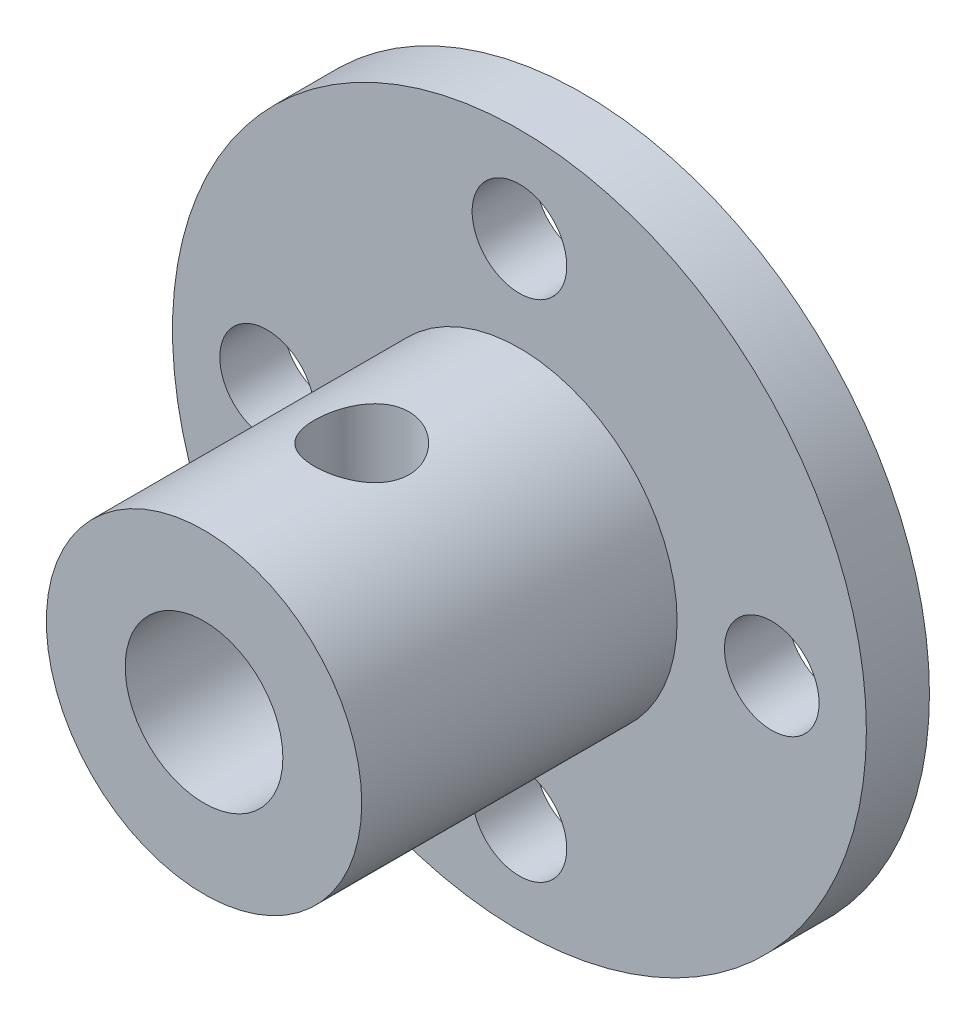
ISO-10303-21;
HEADER;
FILE_DESCRIPTION(('STEP AP214'),'2;1');
FILE_NAME('part.step','',(''),(''),'','','');
FILE_SCHEMA(('AUTOMOTIVE_DESIGN { 1 0 10303 214 1 1 1 1 }'));
ENDSEC;
DATA;
#1=APPLICATION_CONTEXT('core data for automotive mechanical design processes');
#2=APPLICATION_PROTOCOL_DEFINITION('international standard','automotive_design',2000,#1);
#3=PRODUCT_CONTEXT('',#1,'mechanical');
#4=PRODUCT('Part','Part','',(#3));
#5=PRODUCT_RELATED_PRODUCT_CATEGORY('part','',(#4));
#6=PRODUCT_DEFINITION_FORMATION('','',#4);
#7=PRODUCT_DEFINITION_CONTEXT('part definition',#1,'design');
#8=PRODUCT_DEFINITION('design','',#6,#7);
#9=PRODUCT_DEFINITION_SHAPE('','',#8);
#10=(LENGTH_UNIT() NAMED_UNIT(*) SI_UNIT(.MILLI.,.METRE.));
#11=(NAMED_UNIT(*) PLANE_ANGLE_UNIT() SI_UNIT($,.RADIAN.));
#12=(NAMED_UNIT(*) SI_UNIT($,.STERADIAN.) SOLID_ANGLE_UNIT());
#13=UNCERTAINTY_MEASURE_WITH_UNIT(LENGTH_MEASURE(1.E-05),#10,'distance_accuracy_value','');
#14=(GEOMETRIC_REPRESENTATION_CONTEXT(3) GLOBAL_UNCERTAINTY_ASSIGNED_CONTEXT((#13)) GLOBAL_UNIT_ASSIGNED_CONTEXT((#10,
#11,#12)) REPRESENTATION_CONTEXT('',''));
#15=CARTESIAN_POINT('',(0.,0.,0.));
#16=DIRECTION('',(0.,0.,1.));
#17=DIRECTION('',(1.,0.,0.));
#18=AXIS2_PLACEMENT_3D('',#15,#16,#17);
#19=CARTESIAN_POINT('',(0.,0.,2.));
#20=DIRECTION('',(0.,0.,1.));
#21=DIRECTION('',(1.,0.,0.));
#22=AXIS2_PLACEMENT_3D('',#19,#20,#21);
#23=PLANE('',#22);
#24=CARTESIAN_POINT('',(0.,-8.,2.));
#25=DIRECTION('',(0.,0.,1.));
#26=DIRECTION('',(1.,0.,0.));
#27=AXIS2_PLACEMENT_3D('',#24,#25,#26);
#28=CIRCLE('',#27,1.5);
#29=CARTESIAN_POINT('',(1.5,-8.,2.));
#30=VERTEX_POINT('',#29);
#31=EDGE_CURVE('E129',#30,#30,#28,.T.);
#32=ORIENTED_EDGE('',*,*,#31,.F.);
#33=EDGE_LOOP('',(#32));
#34=FACE_BOUND('',#33,.T.);
#35=CARTESIAN_POINT('',(0.,8.,2.));
#36=DIRECTION('',(0.,0.,1.));
#37=DIRECTION('',(1.,0.,0.));
#38=AXIS2_PLACEMENT_3D('',#35,#36,#37);
#39=CIRCLE('',#38,1.5);
#40=CARTESIAN_POINT('',(1.5,8.,2.));
#41=VERTEX_POINT('',#40);
#42=EDGE_CURVE('E143',#41,#41,#39,.T.);
#43=ORIENTED_EDGE('',*,*,#42,.F.);
#44=EDGE_LOOP('',(#43));
#45=FACE_BOUND('',#44,.T.);
#46=CARTESIAN_POINT('',(-8.,0.,2.));
#47=DIRECTION('',(0.,0.,1.));
#48=DIRECTION('',(1.,0.,0.));
#49=AXIS2_PLACEMENT_3D('',#46,#47,#48);
#50=CIRCLE('',#49,1.5);
#51=CARTESIAN_POINT('',(-6.5,0.,2.));
#52=VERTEX_POINT('',#51);
#53=EDGE_CURVE('E50',#52,#52,#50,.T.);
#54=ORIENTED_EDGE('',*,*,#53,.F.);
#55=EDGE_LOOP('',(#54));
#56=FACE_BOUND('',#55,.T.);
#57=CARTESIAN_POINT('',(0.,0.,2.));
#58=DIRECTION('',(0.,0.,1.));
#59=DIRECTION('',(1.,0.,0.));
#60=AXIS2_PLACEMENT_3D('',#57,#58,#59);
#61=CIRCLE('',#60,11.);
#62=CARTESIAN_POINT('',(11.,0.,2.));
#63=VERTEX_POINT('',#62);
#64=EDGE_CURVE('E10',#63,#63,#61,.T.);
#65=ORIENTED_EDGE('',*,*,#64,.T.);
#66=EDGE_LOOP('',(#65));
#67=FACE_BOUND('',#66,.T.);
#68=CARTESIAN_POINT('',(8.,0.,2.));
#69=DIRECTION('',(0.,0.,1.));
#70=DIRECTION('',(1.,0.,0.));
#71=AXIS2_PLACEMENT_3D('',#68,#69,#70);
#72=CIRCLE('',#71,1.5);
#73=CARTESIAN_POINT('',(9.5,0.,2.));
#74=VERTEX_POINT('',#73);
#75=EDGE_CURVE('E139',#74,#74,#72,.T.);
#76=ORIENTED_EDGE('',*,*,#75,.F.);
#77=EDGE_LOOP('',(#76));
#78=FACE_BOUND('',#77,.T.);
#79=CARTESIAN_POINT('',(0.,0.,2.));
#80=DIRECTION('',(0.,0.,1.));
#81=DIRECTION('',(1.,0.,0.));
#82=AXIS2_PLACEMENT_3D('',#79,#80,#81);
#83=CIRCLE('',#82,5.);
#84=CARTESIAN_POINT('',(5.,0.,2.));
#85=VERTEX_POINT('',#84);
#86=EDGE_CURVE('E135',#85,#85,#83,.T.);
#87=ORIENTED_EDGE('',*,*,#86,.F.);
#88=EDGE_LOOP('',(#87));
#89=FACE_BOUND('',#88,.T.);
#90=ADVANCED_FACE('F32',(#34,#45,#56,#67,#78,#89),#23,.T.);
#91=CARTESIAN_POINT('',(0.,0.,0.));
#92=DIRECTION('',(0.,0.,1.));
#93=DIRECTION('',(1.,0.,0.));
#94=AXIS2_PLACEMENT_3D('',#91,#92,#93);
#95=PLANE('',#94);
#96=CARTESIAN_POINT('',(0.,0.,0.));
#97=DIRECTION('',(0.,0.,1.));
#98=DIRECTION('',(1.,0.,0.));
#99=AXIS2_PLACEMENT_3D('',#96,#97,#98);
#100=CIRCLE('',#99,11.);
#101=CARTESIAN_POINT('',(11.,0.,0.));
#102=VERTEX_POINT('',#101);
#103=EDGE_CURVE('E45',#102,#102,#100,.T.);
#104=ORIENTED_EDGE('',*,*,#103,.F.);
#105=EDGE_LOOP('',(#104));
#106=FACE_BOUND('',#105,.T.);
#107=CARTESIAN_POINT('',(-8.,0.,0.));
#108=DIRECTION('',(0.,0.,1.));
#109=DIRECTION('',(1.,0.,0.));
#110=AXIS2_PLACEMENT_3D('',#107,#108,#109);
#111=CIRCLE('',#110,1.5);
#112=CARTESIAN_POINT('',(-6.5,0.,0.));
#113=VERTEX_POINT('',#112);
#114=EDGE_CURVE('E53',#113,#113,#111,.T.);
#115=ORIENTED_EDGE('',*,*,#114,.T.);
#116=EDGE_LOOP('',(#115));
#117=FACE_BOUND('',#116,.T.);
#118=CARTESIAN_POINT('',(0.,0.,0.));
#119=DIRECTION('',(0.,0.,1.));
#120=DIRECTION('',(1.,0.,0.));
#121=AXIS2_PLACEMENT_3D('',#118,#119,#120);
#122=CIRCLE('',#121,2.5);
#123=CARTESIAN_POINT('',(2.5,0.,0.));
#124=VERTEX_POINT('',#123);
#125=EDGE_CURVE('E116',#124,#124,#122,.T.);
#126=ORIENTED_EDGE('',*,*,#125,.T.);
#127=EDGE_LOOP('',(#126));
#128=FACE_BOUND('',#127,.T.);
#129=CARTESIAN_POINT('',(0.,8.,0.));
#130=DIRECTION('',(0.,0.,1.));
#131=DIRECTION('',(1.,0.,0.));
#132=AXIS2_PLACEMENT_3D('',#129,#130,#131);
#133=CIRCLE('',#132,1.5);
#134=CARTESIAN_POINT('',(1.5,8.,0.));
#135=VERTEX_POINT('',#134);
#136=EDGE_CURVE('E120',#135,#135,#133,.T.);
#137=ORIENTED_EDGE('',*,*,#136,.T.);
#138=EDGE_LOOP('',(#137));
#139=FACE_BOUND('',#138,.T.);
#140=CARTESIAN_POINT('',(8.,0.,0.));
#141=DIRECTION('',(0.,0.,1.));
#142=DIRECTION('',(1.,0.,0.));
#143=AXIS2_PLACEMENT_3D('',#140,#141,#142);
#144=CIRCLE('',#143,1.5);
#145=CARTESIAN_POINT('',(9.5,0.,0.));
#146=VERTEX_POINT('',#145);
#147=EDGE_CURVE('E124',#146,#146,#144,.T.);
#148=ORIENTED_EDGE('',*,*,#147,.T.);
#149=EDGE_LOOP('',(#148));
#150=FACE_BOUND('',#149,.T.);
#151=CARTESIAN_POINT('',(0.,-8.,0.));
#152=DIRECTION('',(0.,0.,1.));
#153=DIRECTION('',(1.,0.,0.));
#154=AXIS2_PLACEMENT_3D('',#151,#152,#153);
#155=CIRCLE('',#154,1.5);
#156=CARTESIAN_POINT('',(1.5,-8.,0.));
#157=VERTEX_POINT('',#156);
#158=EDGE_CURVE('E127',#157,#157,#155,.T.);
#159=ORIENTED_EDGE('',*,*,#158,.T.);
#160=EDGE_LOOP('',(#159));
#161=FACE_BOUND('',#160,.T.);
#162=ADVANCED_FACE('F100',(#106,#117,#128,#139,#150,#161),#95,.F.);
#163=CARTESIAN_POINT('',(0.,0.,2.));
#164=DIRECTION('',(0.,0.,-1.));
#165=DIRECTION('',(-1.,0.,0.));
#166=AXIS2_PLACEMENT_3D('',#163,#164,#165);
#167=CYLINDRICAL_SURFACE('',#166,11.);
#168=ORIENTED_EDGE('',*,*,#64,.F.);
#169=EDGE_LOOP('',(#168));
#170=FACE_BOUND('',#169,.T.);
#171=ORIENTED_EDGE('',*,*,#103,.T.);
#172=EDGE_LOOP('',(#171));
#173=FACE_BOUND('',#172,.T.);
#174=ADVANCED_FACE('F34',(#170,#173),#167,.T.);
#175=CARTESIAN_POINT('',(-8.,0.,2.));
#176=DIRECTION('',(0.,0.,-1.));
#177=DIRECTION('',(-1.,0.,0.));
#178=AXIS2_PLACEMENT_3D('',#175,#176,#177);
#179=CYLINDRICAL_SURFACE('',#178,1.5);
#180=ORIENTED_EDGE('',*,*,#53,.T.);
#181=EDGE_LOOP('',(#180));
#182=FACE_BOUND('',#181,.T.);
#183=ORIENTED_EDGE('',*,*,#114,.F.);
#184=EDGE_LOOP('',(#183));
#185=FACE_BOUND('',#184,.T.);
#186=ADVANCED_FACE('F92',(#182,#185),#179,.F.);
#187=CARTESIAN_POINT('',(0.,0.,2.));
#188=DIRECTION('',(0.,0.,-1.));
#189=DIRECTION('',(-1.,0.,0.));
#190=AXIS2_PLACEMENT_3D('',#187,#188,#189);
#191=CYLINDRICAL_SURFACE('',#190,2.5);
#192=CARTESIAN_POINT('',(0.,-2.5,8.5));
#193=CARTESIAN_POINT('',(0.0767298334620158,-2.49999625789732,8.49999590899012));
#194=CARTESIAN_POINT('',(0.153582320644178,-2.4964290461501,8.49407132907374));
#195=CARTESIAN_POINT('',(0.304975509530679,-2.48249903608568,8.47067568048467));
#196=CARTESIAN_POINT('',(0.379510034596047,-2.47211948032719,8.45317613814578));
#197=CARTESIAN_POINT('',(0.523751827790837,-2.44561558054488,8.40761363883314));
#198=CARTESIAN_POINT('',(0.593481028226566,-2.42951973272944,8.37960304183684));
#199=CARTESIAN_POINT('',(0.727030318214659,-2.39295367626407,8.31413966685897));
#200=CARTESIAN_POINT('',(0.790851869416383,-2.37248455380255,8.27668923303125));
#201=CARTESIAN_POINT('',(0.916299278999315,-2.32705360719088,8.19022517329142));
#202=CARTESIAN_POINT('',(0.977384020081416,-2.30186792195985,8.14054630464861));
#203=CARTESIAN_POINT('',(1.09088270411891,-2.25030439279634,8.03253279617173));
#204=CARTESIAN_POINT('',(1.14328534948112,-2.22392505153571,7.97418706281268));
#205=CARTESIAN_POINT('',(1.24444996762974,-2.1691106699591,7.84207648950327));
#206=CARTESIAN_POINT('',(1.29197766378809,-2.14082017703649,7.76729822901871));
#207=CARTESIAN_POINT('',(1.37361437764896,-2.08938301412124,7.60915342675689));
#208=CARTESIAN_POINT('',(1.4077451733516,-2.06622802273938,7.52580110375243));
#209=CARTESIAN_POINT('',(1.45440601714222,-2.0335462966093,7.37340354934676));
#210=CARTESIAN_POINT('',(1.47016197246826,-2.02207883137591,7.30576400138968));
#211=CARTESIAN_POINT('',(1.49216172340475,-2.00590308295503,7.16819628416964));
#212=CARTESIAN_POINT('',(1.49841734556836,-2.00118639643759,7.09827107124551));
#213=CARTESIAN_POINT('',(1.50105508796009,-1.99920922463856,6.95798850578266));
#214=CARTESIAN_POINT('',(1.49741783408419,-2.00196337012718,6.8876305749068));
#215=CARTESIAN_POINT('',(1.48046060478828,-2.01453261443741,6.74872122457241));
#216=CARTESIAN_POINT('',(1.46713334620103,-2.02435302432226,6.68017120415255));
#217=CARTESIAN_POINT('',(1.43173921881792,-2.04953186944258,6.54746975787189));
#218=CARTESIAN_POINT('',(1.40978748666087,-2.06481711652537,6.48327294607552));
#219=CARTESIAN_POINT('',(1.35795061770837,-2.09927051350828,6.35930500907188));
#220=CARTESIAN_POINT('',(1.32806257259705,-2.11844008623465,6.29953551657607));
#221=CARTESIAN_POINT('',(1.25517983184583,-2.16255327268985,6.1750159028772));
#222=CARTESIAN_POINT('',(1.21080724397723,-2.18792043372992,6.11122190704507));
#223=CARTESIAN_POINT('',(1.11291092784003,-2.23930599764381,5.99132351633298));
#224=CARTESIAN_POINT('',(1.05937845100579,-2.26532500262149,5.93522656602349));
#225=CARTESIAN_POINT('',(0.935811834382965,-2.31935504958317,5.82438701817824));
#226=CARTESIAN_POINT('',(0.864517682704956,-2.34713836268532,5.77092269398401));
#227=CARTESIAN_POINT('',(0.712276050458999,-2.39772428433981,5.67687795280209));
#228=CARTESIAN_POINT('',(0.631333763943563,-2.42052955425515,5.63629064621005));
#229=CARTESIAN_POINT('',(0.467197585268205,-2.45730392066151,5.5720678172041));
#230=CARTESIAN_POINT('',(0.384467624173579,-2.47173957439704,5.54752464428409));
#231=CARTESIAN_POINT('',(0.215047895144638,-2.49218842813551,5.51298880259462));
#232=CARTESIAN_POINT('',(0.128363005661318,-2.49821172952738,5.50297868224642));
#233=CARTESIAN_POINT('',(-0.0337146143773977,-2.5009057037461,5.49849215232169));
#234=CARTESIAN_POINT('',(-0.109042473418719,-2.49873521714286,5.50209114491483));
#235=CARTESIAN_POINT('',(-0.257829401986062,-2.48778712087048,5.52042585307192));
#236=CARTESIAN_POINT('',(-0.331288509376107,-2.47900964518037,5.53516134280581));
#237=CARTESIAN_POINT('',(-0.472574932157613,-2.4559479244219,5.57454343281246));
#238=CARTESIAN_POINT('',(-0.540495750928484,-2.44180275662555,5.59894034907347));
#239=CARTESIAN_POINT('',(-0.671265749087263,-2.40913880862844,5.65667737636527));
#240=CARTESIAN_POINT('',(-0.734113924963909,-2.39061916586511,5.69001925134667));
#241=CARTESIAN_POINT('',(-0.860006262823864,-2.3484549623736,5.76855697920871));
#242=CARTESIAN_POINT('',(-0.922394150456837,-2.3244780273988,5.81462382907839));
#243=CARTESIAN_POINT('',(-1.03902603131014,-2.27474265574732,5.91539139348862));
#244=CARTESIAN_POINT('',(-1.09326040273738,-2.2489821658636,5.97010215485254));
#245=CARTESIAN_POINT('',(-1.19931996735579,-2.19445423909891,6.09491039003715));
#246=CARTESIAN_POINT('',(-1.24991019630915,-2.16573241746291,6.1660838854655));
#247=CARTESIAN_POINT('',(-1.33845238915668,-2.1121618206671,6.3172160245682));
#248=CARTESIAN_POINT('',(-1.37641766769781,-2.0873089799769,6.39716529389279));
#249=CARTESIAN_POINT('',(-1.43142578795776,-2.04984909240519,6.54624302230669));
#250=CARTESIAN_POINT('',(-1.4512162533619,-2.03575659328729,6.61398031235859));
#251=CARTESIAN_POINT('',(-1.48113663905972,-2.01409605743544,6.7525320780801));
#252=CARTESIAN_POINT('',(-1.49127995297631,-2.00651897642721,6.82334214432783));
#253=CARTESIAN_POINT('',(-1.50134130416631,-1.99900446616268,6.96637694759703));
#254=CARTESIAN_POINT('',(-1.50122089107869,-1.99909576445937,7.03860599068704));
#255=CARTESIAN_POINT('',(-1.49066472959328,-2.0069771789285,7.18189443560946));
#256=CARTESIAN_POINT('',(-1.48022337215759,-2.0147714813882,7.2529531800806));
#257=CARTESIAN_POINT('',(-1.45040174148913,-2.0363318524298,7.38848841757219));
#258=CARTESIAN_POINT('',(-1.43147636845351,-2.04979211805581,7.45311709430687));
#259=CARTESIAN_POINT('',(-1.38563242076993,-2.08105501960151,7.57833725447422));
#260=CARTESIAN_POINT('',(-1.35871083588479,-2.09885929040482,7.63892720696055));
#261=CARTESIAN_POINT('',(-1.29289245555732,-2.14012990550917,7.76431985722078));
#262=CARTESIAN_POINT('',(-1.25279167675753,-2.16404587582639,7.82834110385431));
#263=CARTESIAN_POINT('',(-1.16375698389084,-2.21320127030768,7.94938007261729));
#264=CARTESIAN_POINT('',(-1.11481579607798,-2.23844177205021,8.00639196215256));
#265=CARTESIAN_POINT('',(-1.00009777425734,-2.29225690291476,8.12135094913167));
#266=CARTESIAN_POINT('',(-0.932876819313905,-2.32070308663658,8.17793107489619));
#267=CARTESIAN_POINT('',(-0.788462434445589,-2.37365428872367,8.27909785586331));
#268=CARTESIAN_POINT('',(-0.71126544450154,-2.39815789310936,8.32368021198479));
#269=CARTESIAN_POINT('',(-0.551125230801454,-2.43985578654394,8.39778580757374));
#270=CARTESIAN_POINT('',(-0.468430086957214,-2.45725077479787,8.42772806492683));
#271=CARTESIAN_POINT('',(-0.297973306118807,-2.48366273001246,8.47272469521097));
#272=CARTESIAN_POINT('',(-0.210232099648612,-2.49271125871485,8.48783516785699));
#273=CARTESIAN_POINT('',(-0.101558096917536,-2.49802001168187,8.49669745470866));
#274=CARTESIAN_POINT('',(-0.0812762590282772,-2.49876114656362,8.4979344173061));
#275=CARTESIAN_POINT('',(-0.0406658206871122,-2.49975164517367,8.49958624637086));
#276=CARTESIAN_POINT('',(-0.0203372186375694,-2.50000099184316,8.50000108432091));
#277=CARTESIAN_POINT('',(0.,-2.5,8.5));
#278=B_SPLINE_CURVE_WITH_KNOTS('',3,(#192,#193,#194,#195,#196,#197,#198,#199,#200,#201,#202,
#203,#204,#205,#206,#207,#208,#209,#210,#211,#212,#213,#214,#215,#216,#217,#218,#219,#220,#221,
#222,#223,#224,#225,#226,#227,#228,#229,#230,#231,#232,#233,#234,#235,#236,#237,#238,#239,#240,
#241,#242,#243,#244,#245,#246,#247,#248,#249,#250,#251,#252,#253,#254,#255,#256,#257,#258,#259,
#260,#261,#262,#263,#264,#265,#266,#267,#268,#269,#270,#271,#272,#273,#274,#275,#276,#277),
.UNSPECIFIED.,.T.,.F.,(4,2,2,2,2,2,2,2,2,2,2,2,2,2,2,2,2,2,2,2,2,2,2,2,2,2,2,2,2,2,2,2,2,2,2,2,
2,2,2,2,2,2,4),(0.,0.230102237548649,0.460772627520012,0.690308884600013,0.919788197992275,
1.16681590732473,1.414162579348,1.69183813189807,1.96906040692092,2.17933829855633,
2.38935420916578,2.59978170870726,2.81036753273872,3.01823267593207,3.22617409809868,
3.47046995225163,3.71500044803674,3.99360957884691,4.27206939275324,4.5329679069656,
4.79355286918236,5.01875602722426,5.24395461863455,5.46367785689772,5.68344445659025,
5.92601365818362,6.16886690081836,6.44336762428009,6.71757792616456,6.93257787314692,
7.14727888733318,7.36278425777433,7.57840681155725,7.78364098331142,7.98895251523035,
8.22578610052286,8.46281544370207,8.73854311775519,9.01436946031985,9.28175654462677,
9.54812832184448,9.60911473335177,9.6701032602764),.UNSPECIFIED.);
#279=CARTESIAN_POINT('',(0.,-2.5,8.5));
#280=VERTEX_POINT('',#279);
#281=EDGE_CURVE('E81',#280,#280,#278,.T.);
#282=ORIENTED_EDGE('',*,*,#281,.F.);
#283=EDGE_LOOP('',(#282));
#284=FACE_BOUND('',#283,.T.);
#285=CARTESIAN_POINT('',(0.,2.5,8.5));
#286=CARTESIAN_POINT('',(-0.0767298334620158,2.49999625789732,8.49999590899012));
#287=CARTESIAN_POINT('',(-0.153582320644178,2.4964290461501,8.49407132907374));
#288=CARTESIAN_POINT('',(-0.304975509530679,2.48249903608568,8.47067568048467));
#289=CARTESIAN_POINT('',(-0.379510034596047,2.47211948032719,8.45317613814578));
#290=CARTESIAN_POINT('',(-0.523751827790837,2.44561558054488,8.40761363883314));
#291=CARTESIAN_POINT('',(-0.593481028226566,2.42951973272944,8.37960304183684));
#292=CARTESIAN_POINT('',(-0.727030318214659,2.39295367626407,8.31413966685897));
#293=CARTESIAN_POINT('',(-0.790851869416383,2.37248455380255,8.27668923303125));
#294=CARTESIAN_POINT('',(-0.916299278999315,2.32705360719088,8.19022517329142));
#295=CARTESIAN_POINT('',(-0.977384020081416,2.30186792195985,8.14054630464861));
#296=CARTESIAN_POINT('',(-1.09088270411891,2.25030439279634,8.03253279617173));
#297=CARTESIAN_POINT('',(-1.14328534948112,2.22392505153571,7.97418706281268));
#298=CARTESIAN_POINT('',(-1.24444996762974,2.1691106699591,7.84207648950327));
#299=CARTESIAN_POINT('',(-1.29197766378809,2.14082017703649,7.76729822901871));
#300=CARTESIAN_POINT('',(-1.37361437764896,2.08938301412124,7.60915342675689));
#301=CARTESIAN_POINT('',(-1.4077451733516,2.06622802273938,7.52580110375243));
#302=CARTESIAN_POINT('',(-1.45440601714222,2.0335462966093,7.37340354934676));
#303=CARTESIAN_POINT('',(-1.47016197246826,2.02207883137591,7.30576400138968));
#304=CARTESIAN_POINT('',(-1.49216172340475,2.00590308295503,7.16819628416964));
#305=CARTESIAN_POINT('',(-1.49841734556836,2.00118639643759,7.09827107124551));
#306=CARTESIAN_POINT('',(-1.50105508796009,1.99920922463856,6.95798850578266));
#307=CARTESIAN_POINT('',(-1.49741783408419,2.00196337012718,6.8876305749068));
#308=CARTESIAN_POINT('',(-1.48046060478828,2.01453261443741,6.74872122457241));
#309=CARTESIAN_POINT('',(-1.46713334620103,2.02435302432226,6.68017120415255));
#310=CARTESIAN_POINT('',(-1.43173921881792,2.04953186944258,6.54746975787189));
#311=CARTESIAN_POINT('',(-1.40978748666087,2.06481711652537,6.48327294607552));
#312=CARTESIAN_POINT('',(-1.35795061770837,2.09927051350828,6.35930500907188));
#313=CARTESIAN_POINT('',(-1.32806257259705,2.11844008623465,6.29953551657607));
#314=CARTESIAN_POINT('',(-1.25517983184583,2.16255327268985,6.1750159028772));
#315=CARTESIAN_POINT('',(-1.21080724397723,2.18792043372992,6.11122190704507));
#316=CARTESIAN_POINT('',(-1.11291092784003,2.23930599764381,5.99132351633298));
#317=CARTESIAN_POINT('',(-1.05937845100579,2.26532500262149,5.93522656602349));
#318=CARTESIAN_POINT('',(-0.935811834382965,2.31935504958317,5.82438701817824));
#319=CARTESIAN_POINT('',(-0.864517682704956,2.34713836268532,5.77092269398401));
#320=CARTESIAN_POINT('',(-0.712276050458999,2.39772428433981,5.67687795280209));
#321=CARTESIAN_POINT('',(-0.631333763943563,2.42052955425515,5.63629064621005));
#322=CARTESIAN_POINT('',(-0.467197585268205,2.45730392066151,5.5720678172041));
#323=CARTESIAN_POINT('',(-0.384467624173579,2.47173957439704,5.54752464428409));
#324=CARTESIAN_POINT('',(-0.215047895144638,2.49218842813551,5.51298880259462));
#325=CARTESIAN_POINT('',(-0.128363005661318,2.49821172952738,5.50297868224642));
#326=CARTESIAN_POINT('',(0.0337146143773977,2.5009057037461,5.49849215232169));
#327=CARTESIAN_POINT('',(0.109042473418719,2.49873521714286,5.50209114491483));
#328=CARTESIAN_POINT('',(0.257829401986062,2.48778712087048,5.52042585307192));
#329=CARTESIAN_POINT('',(0.331288509376107,2.47900964518037,5.53516134280581));
#330=CARTESIAN_POINT('',(0.472574932157613,2.4559479244219,5.57454343281246));
#331=CARTESIAN_POINT('',(0.540495750928484,2.44180275662555,5.59894034907347));
#332=CARTESIAN_POINT('',(0.671265749087263,2.40913880862844,5.65667737636527));
#333=CARTESIAN_POINT('',(0.734113924963909,2.39061916586511,5.69001925134667));
#334=CARTESIAN_POINT('',(0.860006262823864,2.3484549623736,5.76855697920871));
#335=CARTESIAN_POINT('',(0.922394150456837,2.3244780273988,5.81462382907839));
#336=CARTESIAN_POINT('',(1.03902603131014,2.27474265574732,5.91539139348862));
#337=CARTESIAN_POINT('',(1.09326040273738,2.2489821658636,5.97010215485254));
#338=CARTESIAN_POINT('',(1.19931996735579,2.19445423909891,6.09491039003715));
#339=CARTESIAN_POINT('',(1.24991019630915,2.16573241746291,6.1660838854655));
#340=CARTESIAN_POINT('',(1.33845238915668,2.1121618206671,6.3172160245682));
#341=CARTESIAN_POINT('',(1.37641766769781,2.0873089799769,6.39716529389279));
#342=CARTESIAN_POINT('',(1.43142578795776,2.04984909240519,6.54624302230669));
#343=CARTESIAN_POINT('',(1.4512162533619,2.03575659328729,6.61398031235859));
#344=CARTESIAN_POINT('',(1.48113663905972,2.01409605743544,6.7525320780801));
#345=CARTESIAN_POINT('',(1.49127995297631,2.00651897642721,6.82334214432783));
#346=CARTESIAN_POINT('',(1.50134130416631,1.99900446616268,6.96637694759703));
#347=CARTESIAN_POINT('',(1.50122089107869,1.99909576445937,7.03860599068704));
#348=CARTESIAN_POINT('',(1.49066472959328,2.0069771789285,7.18189443560946));
#349=CARTESIAN_POINT('',(1.48022337215759,2.0147714813882,7.2529531800806));
#350=CARTESIAN_POINT('',(1.45040174148913,2.0363318524298,7.38848841757219));
#351=CARTESIAN_POINT('',(1.43147636845351,2.04979211805581,7.45311709430687));
#352=CARTESIAN_POINT('',(1.38563242076993,2.08105501960151,7.57833725447422));
#353=CARTESIAN_POINT('',(1.35871083588479,2.09885929040482,7.63892720696055));
#354=CARTESIAN_POINT('',(1.29289245555732,2.14012990550917,7.76431985722078));
#355=CARTESIAN_POINT('',(1.25279167675753,2.16404587582639,7.82834110385431));
#356=CARTESIAN_POINT('',(1.16375698389084,2.21320127030768,7.94938007261729));
#357=CARTESIAN_POINT('',(1.11481579607798,2.23844177205021,8.00639196215256));
#358=CARTESIAN_POINT('',(1.00009777425734,2.29225690291476,8.12135094913167));
#359=CARTESIAN_POINT('',(0.932876819313905,2.32070308663658,8.17793107489619));
#360=CARTESIAN_POINT('',(0.788462434445589,2.37365428872367,8.27909785586331));
#361=CARTESIAN_POINT('',(0.71126544450154,2.39815789310936,8.32368021198479));
#362=CARTESIAN_POINT('',(0.551125230801454,2.43985578654394,8.39778580757374));
#363=CARTESIAN_POINT('',(0.468430086957214,2.45725077479787,8.42772806492683));
#364=CARTESIAN_POINT('',(0.297973306118807,2.48366273001246,8.47272469521097));
#365=CARTESIAN_POINT('',(0.210232099648612,2.49271125871485,8.48783516785699));
#366=CARTESIAN_POINT('',(0.101558096917536,2.49802001168187,8.49669745470866));
#367=CARTESIAN_POINT('',(0.0812762590282772,2.49876114656362,8.4979344173061));
#368=CARTESIAN_POINT('',(0.0406658206871122,2.49975164517367,8.49958624637086));
#369=CARTESIAN_POINT('',(0.0203372186375694,2.50000099184316,8.50000108432091));
#370=CARTESIAN_POINT('',(0.,2.5,8.5));
#371=B_SPLINE_CURVE_WITH_KNOTS('',3,(#285,#286,#287,#288,#289,#290,#291,#292,#293,#294,#295,
#296,#297,#298,#299,#300,#301,#302,#303,#304,#305,#306,#307,#308,#309,#310,#311,#312,#313,#314,
#315,#316,#317,#318,#319,#320,#321,#322,#323,#324,#325,#326,#327,#328,#329,#330,#331,#332,#333,
#334,#335,#336,#337,#338,#339,#340,#341,#342,#343,#344,#345,#346,#347,#348,#349,#350,#351,#352,
#353,#354,#355,#356,#357,#358,#359,#360,#361,#362,#363,#364,#365,#366,#367,#368,#369,#370),
.UNSPECIFIED.,.T.,.F.,(4,2,2,2,2,2,2,2,2,2,2,2,2,2,2,2,2,2,2,2,2,2,2,2,2,2,2,2,2,2,2,2,2,2,2,2,
2,2,2,2,2,2,4),(0.,0.230102237548649,0.460772627520012,0.690308884600013,0.919788197992275,
1.16681590732473,1.414162579348,1.69183813189807,1.96906040692092,2.17933829855633,
2.38935420916578,2.59978170870726,2.81036753273872,3.01823267593207,3.22617409809868,
3.47046995225163,3.71500044803674,3.99360957884691,4.27206939275324,4.5329679069656,
4.79355286918236,5.01875602722426,5.24395461863455,5.46367785689772,5.68344445659025,
5.92601365818362,6.16886690081836,6.44336762428009,6.71757792616456,6.93257787314692,
7.14727888733318,7.36278425777433,7.57840681155725,7.78364098331142,7.98895251523035,
8.22578610052286,8.46281544370207,8.73854311775519,9.01436946031985,9.28175654462677,
9.54812832184448,9.60911473335177,9.6701032602764),.UNSPECIFIED.);
#372=CARTESIAN_POINT('',(0.,2.5,8.5));
#373=VERTEX_POINT('',#372);
#374=EDGE_CURVE('E75',#373,#373,#371,.T.);
#375=ORIENTED_EDGE('',*,*,#374,.F.);
#376=EDGE_LOOP('',(#375));
#377=FACE_BOUND('',#376,.T.);
#378=ORIENTED_EDGE('',*,*,#125,.F.);
#379=EDGE_LOOP('',(#378));
#380=FACE_BOUND('',#379,.T.);
#381=CARTESIAN_POINT('',(0.,0.,12.));
#382=DIRECTION('',(0.,0.,1.));
#383=DIRECTION('',(1.,0.,0.));
#384=AXIS2_PLACEMENT_3D('',#381,#382,#383);
#385=CIRCLE('',#384,2.5);
#386=CARTESIAN_POINT('',(2.5,0.,12.));
#387=VERTEX_POINT('',#386);
#388=EDGE_CURVE('E157',#387,#387,#385,.T.);
#389=ORIENTED_EDGE('',*,*,#388,.T.);
#390=EDGE_LOOP('',(#389));
#391=FACE_BOUND('',#390,.T.);
#392=ADVANCED_FACE('F86',(#284,#377,#380,#391),#191,.F.);
#393=CARTESIAN_POINT('',(0.,8.,2.));
#394=DIRECTION('',(0.,0.,-1.));
#395=DIRECTION('',(-1.,0.,0.));
#396=AXIS2_PLACEMENT_3D('',#393,#394,#395);
#397=CYLINDRICAL_SURFACE('',#396,1.5);
#398=ORIENTED_EDGE('',*,*,#42,.T.);
#399=EDGE_LOOP('',(#398));
#400=FACE_BOUND('',#399,.T.);
#401=ORIENTED_EDGE('',*,*,#136,.F.);
#402=EDGE_LOOP('',(#401));
#403=FACE_BOUND('',#402,.T.);
#404=ADVANCED_FACE('F91',(#400,#403),#397,.F.);
#405=CARTESIAN_POINT('',(8.,0.,2.));
#406=DIRECTION('',(0.,0.,-1.));
#407=DIRECTION('',(-1.,0.,0.));
#408=AXIS2_PLACEMENT_3D('',#405,#406,#407);
#409=CYLINDRICAL_SURFACE('',#408,1.5);
#410=ORIENTED_EDGE('',*,*,#75,.T.);
#411=EDGE_LOOP('',(#410));
#412=FACE_BOUND('',#411,.T.);
#413=ORIENTED_EDGE('',*,*,#147,.F.);
#414=EDGE_LOOP('',(#413));
#415=FACE_BOUND('',#414,.T.);
#416=ADVANCED_FACE('F183',(#412,#415),#409,.F.);
#417=CARTESIAN_POINT('',(0.,-8.,2.));
#418=DIRECTION('',(0.,0.,-1.));
#419=DIRECTION('',(-1.,0.,0.));
#420=AXIS2_PLACEMENT_3D('',#417,#418,#419);
#421=CYLINDRICAL_SURFACE('',#420,1.5);
#422=ORIENTED_EDGE('',*,*,#31,.T.);
#423=EDGE_LOOP('',(#422));
#424=FACE_BOUND('',#423,.T.);
#425=ORIENTED_EDGE('',*,*,#158,.F.);
#426=EDGE_LOOP('',(#425));
#427=FACE_BOUND('',#426,.T.);
#428=ADVANCED_FACE('F179',(#424,#427),#421,.F.);
#429=CARTESIAN_POINT('',(0.,0.,12.));
#430=DIRECTION('',(0.,0.,1.));
#431=DIRECTION('',(1.,0.,0.));
#432=AXIS2_PLACEMENT_3D('',#429,#430,#431);
#433=PLANE('',#432);
#434=CARTESIAN_POINT('',(0.,0.,12.));
#435=DIRECTION('',(0.,0.,1.));
#436=DIRECTION('',(1.,0.,0.));
#437=AXIS2_PLACEMENT_3D('',#434,#435,#436);
#438=CIRCLE('',#437,5.);
#439=CARTESIAN_POINT('',(5.,0.,12.));
#440=VERTEX_POINT('',#439);
#441=EDGE_CURVE('E130',#440,#440,#438,.T.);
#442=ORIENTED_EDGE('',*,*,#441,.T.);
#443=EDGE_LOOP('',(#442));
#444=FACE_BOUND('',#443,.T.);
#445=ORIENTED_EDGE('',*,*,#388,.F.);
#446=EDGE_LOOP('',(#445));
#447=FACE_BOUND('',#446,.T.);
#448=ADVANCED_FACE('F69',(#444,#447),#433,.T.);
#449=CARTESIAN_POINT('',(0.,0.,12.));
#450=DIRECTION('',(0.,0.,-1.));
#451=DIRECTION('',(-1.,0.,0.));
#452=AXIS2_PLACEMENT_3D('',#449,#450,#451);
#453=CYLINDRICAL_SURFACE('',#452,5.);
#454=CARTESIAN_POINT('',(0.,-5.,8.5));
#455=CARTESIAN_POINT('',(0.0822886127532999,-4.9999992925055,8.49999900251511));
#456=CARTESIAN_POINT('',(0.164587318351529,-4.99794915693954,8.49320613637603));
#457=CARTESIAN_POINT('',(0.326788125304881,-4.98997105593691,8.4662786457779));
#458=CARTESIAN_POINT('',(0.40668950441142,-4.98404193389692,8.44614004197666));
#459=CARTESIAN_POINT('',(0.561732707754527,-4.96895552501836,8.39325398308974));
#460=CARTESIAN_POINT('',(0.636881364395373,-4.95980300250425,8.36052513038107));
#461=CARTESIAN_POINT('',(0.780624181053132,-4.93922109237645,8.28346390694417));
#462=CARTESIAN_POINT('',(0.84921746746967,-4.92779140192067,8.23912999260458));
#463=CARTESIAN_POINT('',(0.979871797183745,-4.90350737192774,8.13877599252733));
#464=CARTESIAN_POINT('',(1.04171807124434,-4.89062383657036,8.08248337411409));
#465=CARTESIAN_POINT('',(1.15524920923324,-4.86505834210442,7.96039077008982));
#466=CARTESIAN_POINT('',(1.20693236327441,-4.85237641724501,7.89458918787504));
#467=CARTESIAN_POINT('',(1.29980037723708,-4.82834113993772,7.75352924696239));
#468=CARTESIAN_POINT('',(1.34072309022213,-4.81702406663875,7.67809153900926));
#469=CARTESIAN_POINT('',(1.4092139477476,-4.79743620394031,7.52101074576971));
#470=CARTESIAN_POINT('',(1.43678529919973,-4.78916468313311,7.43936915607202));
#471=CARTESIAN_POINT('',(1.47701633682652,-4.77690870838434,7.27460973386954));
#472=CARTESIAN_POINT('',(1.49007196234677,-4.77281069324533,7.19159725613606));
#473=CARTESIAN_POINT('',(1.50213730614672,-4.76902789749767,7.02446684378323));
#474=CARTESIAN_POINT('',(1.50115042761078,-4.76934204760571,6.94034918194091));
#475=CARTESIAN_POINT('',(1.48546977199812,-4.77424744067778,6.77661609139152));
#476=CARTESIAN_POINT('',(1.47127205262685,-4.7786838859914,6.69694774963776));
#477=CARTESIAN_POINT('',(1.43037420427056,-4.79108356228624,6.54118021372654));
#478=CARTESIAN_POINT('',(1.40367284141641,-4.79904714132351,6.46508137262567));
#479=CARTESIAN_POINT('',(1.33816026653682,-4.81772733074973,6.31739965033926));
#480=CARTESIAN_POINT('',(1.29918816934642,-4.82848016115952,6.24589291604474));
#481=CARTESIAN_POINT('',(1.21035222588683,-4.85150987000065,6.11026797798981));
#482=CARTESIAN_POINT('',(1.16048574002588,-4.86378711746991,6.04615157058622));
#483=CARTESIAN_POINT('',(1.04881290765546,-4.88911011297937,5.92431380923798));
#484=CARTESIAN_POINT('',(0.986594907466971,-4.90216654310498,5.86697133597033));
#485=CARTESIAN_POINT('',(0.853263259313966,-4.92712244063259,5.76344601593575));
#486=CARTESIAN_POINT('',(0.782149051860887,-4.9390218351841,5.71726387158557));
#487=CARTESIAN_POINT('',(0.632355038342802,-4.9604316006947,5.63714007753527));
#488=CARTESIAN_POINT('',(0.553627749747949,-4.96992543668314,5.60328248375014));
#489=CARTESIAN_POINT('',(0.391245415603518,-4.98533521832222,5.54940040990037));
#490=CARTESIAN_POINT('',(0.307591751589581,-4.99125216186999,5.52937207146751));
#491=CARTESIAN_POINT('',(0.140952242668331,-4.99868364643538,5.50434782210061));
#492=CARTESIAN_POINT('',(0.058050097601186,-5.0003485041779,5.49883841419839));
#493=CARTESIAN_POINT('',(-0.107499605823384,-4.9995292324176,5.50156915571208));
#494=CARTESIAN_POINT('',(-0.190147196690782,-4.99704565677756,5.50980746965144));
#495=CARTESIAN_POINT('',(-0.350903605309698,-4.98830696987163,5.5393846111115));
#496=CARTESIAN_POINT('',(-0.42907277261417,-4.98213829799417,5.56042338758087));
#497=CARTESIAN_POINT('',(-0.580754638954523,-4.96674347841533,5.6146432327782));
#498=CARTESIAN_POINT('',(-0.654266777025584,-4.95751696321085,5.64782576103786));
#499=CARTESIAN_POINT('',(-0.796437189461053,-4.93669654351325,5.72625316548113));
#500=CARTESIAN_POINT('',(-0.86494382619967,-4.92505280829675,5.77175934094797));
#501=CARTESIAN_POINT('',(-0.993523307980148,-4.90073468764318,5.87322475405281));
#502=CARTESIAN_POINT('',(-1.05359403235594,-4.8880600443108,5.92918661188767));
#503=CARTESIAN_POINT('',(-1.16585744551027,-4.86253171869138,6.05238730836935));
#504=CARTESIAN_POINT('',(-1.21768481231504,-4.84968825033268,6.11996187577174));
#505=CARTESIAN_POINT('',(-1.30928995072154,-4.82576515238464,6.26312793901353));
#506=CARTESIAN_POINT('',(-1.34906803829472,-4.81468547654651,6.33871922455821));
#507=CARTESIAN_POINT('',(-1.41517347127168,-4.79567189615055,6.49553249125469));
#508=CARTESIAN_POINT('',(-1.4415634693705,-4.78772337843827,6.57672618653659));
#509=CARTESIAN_POINT('',(-1.48021730815114,-4.77591594362794,6.74268796893148));
#510=CARTESIAN_POINT('',(-1.49248598978779,-4.772055625083,6.82745482078767));
#511=CARTESIAN_POINT('',(-1.50221984485059,-4.76899972496087,6.99436151837623));
#512=CARTESIAN_POINT('',(-1.5002805530849,-4.76961647442754,7.07646365101759));
#513=CARTESIAN_POINT('',(-1.48307505444813,-4.77499401288294,7.2391141033728));
#514=CARTESIAN_POINT('',(-1.46780938124716,-4.77975463592551,7.31966248517636));
#515=CARTESIAN_POINT('',(-1.42476888804136,-4.79275763670386,7.47594539914285));
#516=CARTESIAN_POINT('',(-1.39715175507068,-4.80095604545965,7.55172728736169));
#517=CARTESIAN_POINT('',(-1.33031507121129,-4.81990278909136,7.69764243881772));
#518=CARTESIAN_POINT('',(-1.29109329962876,-4.83065161194312,7.76777461764076));
#519=CARTESIAN_POINT('',(-1.20048763805072,-4.85397676425833,7.90316311652711));
#520=CARTESIAN_POINT('',(-1.14871276092994,-4.86660540163798,7.96814876126041));
#521=CARTESIAN_POINT('',(-1.03517434629782,-4.89201320450026,8.08870249830786));
#522=CARTESIAN_POINT('',(-0.973408217134499,-4.90479240823905,8.14426813946776));
#523=CARTESIAN_POINT('',(-0.839465762183246,-4.92950936570649,8.24602341229503));
#524=CARTESIAN_POINT('',(-0.767037885790606,-4.94141159765674,8.29189144685549));
#525=CARTESIAN_POINT('',(-0.615141373983528,-4.96260680455813,8.37073516990402));
#526=CARTESIAN_POINT('',(-0.535676052998954,-4.97190099931067,8.40371688827451));
#527=CARTESIAN_POINT('',(-0.380757712655281,-4.98602174969301,8.45289527565275));
#528=CARTESIAN_POINT('',(-0.305786961954234,-4.99122027381068,8.47051167288325));
#529=CARTESIAN_POINT('',(-0.153880195230779,-4.99820944494492,8.49406352524158));
#530=CARTESIAN_POINT('',(-0.0769445098581395,-5.0000006615474,8.50000093270482));
#531=CARTESIAN_POINT('',(0.,-5.,8.5));
#532=B_SPLINE_CURVE_WITH_KNOTS('',3,(#454,#455,#456,#457,#458,#459,#460,#461,#462,#463,#464,
#465,#466,#467,#468,#469,#470,#471,#472,#473,#474,#475,#476,#477,#478,#479,#480,#481,#482,#483,
#484,#485,#486,#487,#488,#489,#490,#491,#492,#493,#494,#495,#496,#497,#498,#499,#500,#501,#502,
#503,#504,#505,#506,#507,#508,#509,#510,#511,#512,#513,#514,#515,#516,#517,#518,#519,#520,#521,
#522,#523,#524,#525,#526,#527,#528,#529,#530,#531),.UNSPECIFIED.,.T.,.F.,(4,2,2,2,2,2,2,2,2,2,2,
2,2,2,2,2,2,2,2,2,2,2,2,2,2,2,2,2,2,2,2,2,2,2,2,2,2,2,4),(0.,0.24658320361261,0.493239964846,
0.739533676300875,0.985860164412702,1.23855602948191,1.49129437288633,1.74971481004109,
2.00807314543224,2.25919689356599,2.51025978319089,2.75226016697676,2.99428443658001,
3.2396242644712,3.48502360158556,3.74067104048167,3.99633456531072,4.25371046881689,
4.51101453528808,4.75908809438545,5.00712853550327,5.24956746682327,5.49203554593729,
5.74011305702908,5.98825282000191,6.24540400322818,6.5025484425268,6.75847814951252,
7.01432009460283,7.25950155466943,7.504673196616,7.74680040402721,7.98897397553107,
8.23996925679931,8.49102974897503,8.74942996156671,9.00770911595235,9.23831691930459,
9.46888616948874),.UNSPECIFIED.);
#533=CARTESIAN_POINT('',(0.,-5.,8.5));
#534=VERTEX_POINT('',#533);
#535=EDGE_CURVE('E36',#534,#534,#532,.T.);
#536=ORIENTED_EDGE('',*,*,#535,.T.);
#537=EDGE_LOOP('',(#536));
#538=FACE_BOUND('',#537,.T.);
#539=CARTESIAN_POINT('',(0.,5.,8.5));
#540=CARTESIAN_POINT('',(-0.0822886127532999,4.9999992925055,8.49999900251511));
#541=CARTESIAN_POINT('',(-0.164587318351529,4.99794915693954,8.49320613637603));
#542=CARTESIAN_POINT('',(-0.326788125304881,4.98997105593691,8.4662786457779));
#543=CARTESIAN_POINT('',(-0.40668950441142,4.98404193389692,8.44614004197666));
#544=CARTESIAN_POINT('',(-0.561732707754527,4.96895552501836,8.39325398308974));
#545=CARTESIAN_POINT('',(-0.636881364395373,4.95980300250425,8.36052513038107));
#546=CARTESIAN_POINT('',(-0.780624181053132,4.93922109237645,8.28346390694417));
#547=CARTESIAN_POINT('',(-0.84921746746967,4.92779140192067,8.23912999260458));
#548=CARTESIAN_POINT('',(-0.979871797183745,4.90350737192774,8.13877599252733));
#549=CARTESIAN_POINT('',(-1.04171807124434,4.89062383657036,8.08248337411409));
#550=CARTESIAN_POINT('',(-1.15524920923324,4.86505834210442,7.96039077008982));
#551=CARTESIAN_POINT('',(-1.20693236327441,4.85237641724501,7.89458918787504));
#552=CARTESIAN_POINT('',(-1.29980037723708,4.82834113993772,7.75352924696239));
#553=CARTESIAN_POINT('',(-1.34072309022213,4.81702406663875,7.67809153900926));
#554=CARTESIAN_POINT('',(-1.4092139477476,4.79743620394031,7.52101074576971));
#555=CARTESIAN_POINT('',(-1.43678529919973,4.78916468313311,7.43936915607202));
#556=CARTESIAN_POINT('',(-1.47701633682652,4.77690870838434,7.27460973386954));
#557=CARTESIAN_POINT('',(-1.49007196234677,4.77281069324533,7.19159725613606));
#558=CARTESIAN_POINT('',(-1.50213730614672,4.76902789749767,7.02446684378323));
#559=CARTESIAN_POINT('',(-1.50115042761078,4.76934204760571,6.94034918194091));
#560=CARTESIAN_POINT('',(-1.48546977199812,4.77424744067778,6.77661609139152));
#561=CARTESIAN_POINT('',(-1.47127205262685,4.7786838859914,6.69694774963776));
#562=CARTESIAN_POINT('',(-1.43037420427056,4.79108356228624,6.54118021372654));
#563=CARTESIAN_POINT('',(-1.40367284141641,4.79904714132351,6.46508137262567));
#564=CARTESIAN_POINT('',(-1.33816026653682,4.81772733074973,6.31739965033926));
#565=CARTESIAN_POINT('',(-1.29918816934642,4.82848016115952,6.24589291604474));
#566=CARTESIAN_POINT('',(-1.21035222588683,4.85150987000065,6.11026797798981));
#567=CARTESIAN_POINT('',(-1.16048574002588,4.86378711746991,6.04615157058622));
#568=CARTESIAN_POINT('',(-1.04881290765546,4.88911011297937,5.92431380923798));
#569=CARTESIAN_POINT('',(-0.986594907466971,4.90216654310498,5.86697133597033));
#570=CARTESIAN_POINT('',(-0.853263259313966,4.92712244063259,5.76344601593575));
#571=CARTESIAN_POINT('',(-0.782149051860887,4.9390218351841,5.71726387158557));
#572=CARTESIAN_POINT('',(-0.632355038342802,4.9604316006947,5.63714007753527));
#573=CARTESIAN_POINT('',(-0.553627749747949,4.96992543668314,5.60328248375014));
#574=CARTESIAN_POINT('',(-0.391245415603518,4.98533521832222,5.54940040990037));
#575=CARTESIAN_POINT('',(-0.307591751589581,4.99125216186999,5.52937207146751));
#576=CARTESIAN_POINT('',(-0.140952242668331,4.99868364643538,5.50434782210061));
#577=CARTESIAN_POINT('',(-0.058050097601186,5.0003485041779,5.49883841419839));
#578=CARTESIAN_POINT('',(0.107499605823384,4.9995292324176,5.50156915571208));
#579=CARTESIAN_POINT('',(0.190147196690782,4.99704565677756,5.50980746965144));
#580=CARTESIAN_POINT('',(0.350903605309698,4.98830696987163,5.5393846111115));
#581=CARTESIAN_POINT('',(0.42907277261417,4.98213829799417,5.56042338758087));
#582=CARTESIAN_POINT('',(0.580754638954523,4.96674347841533,5.6146432327782));
#583=CARTESIAN_POINT('',(0.654266777025584,4.95751696321085,5.64782576103786));
#584=CARTESIAN_POINT('',(0.796437189461053,4.93669654351325,5.72625316548113));
#585=CARTESIAN_POINT('',(0.86494382619967,4.92505280829675,5.77175934094797));
#586=CARTESIAN_POINT('',(0.993523307980148,4.90073468764318,5.87322475405281));
#587=CARTESIAN_POINT('',(1.05359403235594,4.8880600443108,5.92918661188767));
#588=CARTESIAN_POINT('',(1.16585744551027,4.86253171869138,6.05238730836935));
#589=CARTESIAN_POINT('',(1.21768481231504,4.84968825033268,6.11996187577174));
#590=CARTESIAN_POINT('',(1.30928995072154,4.82576515238464,6.26312793901353));
#591=CARTESIAN_POINT('',(1.34906803829472,4.81468547654651,6.33871922455821));
#592=CARTESIAN_POINT('',(1.41517347127168,4.79567189615055,6.49553249125469));
#593=CARTESIAN_POINT('',(1.4415634693705,4.78772337843827,6.57672618653659));
#594=CARTESIAN_POINT('',(1.48021730815114,4.77591594362794,6.74268796893148));
#595=CARTESIAN_POINT('',(1.49248598978779,4.772055625083,6.82745482078767));
#596=CARTESIAN_POINT('',(1.50221984485059,4.76899972496087,6.99436151837623));
#597=CARTESIAN_POINT('',(1.5002805530849,4.76961647442754,7.07646365101759));
#598=CARTESIAN_POINT('',(1.48307505444813,4.77499401288294,7.2391141033728));
#599=CARTESIAN_POINT('',(1.46780938124716,4.77975463592551,7.31966248517636));
#600=CARTESIAN_POINT('',(1.42476888804136,4.79275763670386,7.47594539914285));
#601=CARTESIAN_POINT('',(1.39715175507068,4.80095604545965,7.55172728736169));
#602=CARTESIAN_POINT('',(1.33031507121129,4.81990278909136,7.69764243881772));
#603=CARTESIAN_POINT('',(1.29109329962876,4.83065161194312,7.76777461764076));
#604=CARTESIAN_POINT('',(1.20048763805072,4.85397676425833,7.90316311652711));
#605=CARTESIAN_POINT('',(1.14871276092994,4.86660540163798,7.96814876126041));
#606=CARTESIAN_POINT('',(1.03517434629782,4.89201320450026,8.08870249830786));
#607=CARTESIAN_POINT('',(0.973408217134499,4.90479240823905,8.14426813946776));
#608=CARTESIAN_POINT('',(0.839465762183246,4.92950936570649,8.24602341229503));
#609=CARTESIAN_POINT('',(0.767037885790606,4.94141159765674,8.29189144685549));
#610=CARTESIAN_POINT('',(0.615141373983528,4.96260680455813,8.37073516990402));
#611=CARTESIAN_POINT('',(0.535676052998954,4.97190099931067,8.40371688827451));
#612=CARTESIAN_POINT('',(0.380757712655281,4.98602174969301,8.45289527565275));
#613=CARTESIAN_POINT('',(0.305786961954234,4.99122027381068,8.47051167288325));
#614=CARTESIAN_POINT('',(0.153880195230779,4.99820944494492,8.49406352524158));
#615=CARTESIAN_POINT('',(0.0769445098581395,5.0000006615474,8.50000093270482));
#616=CARTESIAN_POINT('',(0.,5.,8.5));
#617=B_SPLINE_CURVE_WITH_KNOTS('',3,(#539,#540,#541,#542,#543,#544,#545,#546,#547,#548,#549,
#550,#551,#552,#553,#554,#555,#556,#557,#558,#559,#560,#561,#562,#563,#564,#565,#566,#567,#568,
#569,#570,#571,#572,#573,#574,#575,#576,#577,#578,#579,#580,#581,#582,#583,#584,#585,#586,#587,
#588,#589,#590,#591,#592,#593,#594,#595,#596,#597,#598,#599,#600,#601,#602,#603,#604,#605,#606,
#607,#608,#609,#610,#611,#612,#613,#614,#615,#616),.UNSPECIFIED.,.T.,.F.,(4,2,2,2,2,2,2,2,2,2,2,
2,2,2,2,2,2,2,2,2,2,2,2,2,2,2,2,2,2,2,2,2,2,2,2,2,2,2,4),(0.,0.24658320361261,0.493239964846,
0.739533676300875,0.985860164412702,1.23855602948191,1.49129437288633,1.74971481004109,
2.00807314543224,2.25919689356599,2.51025978319089,2.75226016697676,2.99428443658001,
3.2396242644712,3.48502360158556,3.74067104048167,3.99633456531072,4.25371046881689,
4.51101453528808,4.75908809438545,5.00712853550327,5.24956746682327,5.49203554593729,
5.74011305702908,5.98825282000191,6.24540400322818,6.5025484425268,6.75847814951252,
7.01432009460283,7.25950155466943,7.504673196616,7.74680040402721,7.98897397553107,
8.23996925679931,8.49102974897503,8.74942996156671,9.00770911595235,9.23831691930459,
9.46888616948874),.UNSPECIFIED.);
#618=CARTESIAN_POINT('',(0.,5.,8.5));
#619=VERTEX_POINT('',#618);
#620=EDGE_CURVE('E55',#619,#619,#617,.T.);
#621=ORIENTED_EDGE('',*,*,#620,.T.);
#622=EDGE_LOOP('',(#621));
#623=FACE_BOUND('',#622,.T.);
#624=ORIENTED_EDGE('',*,*,#441,.F.);
#625=EDGE_LOOP('',(#624));
#626=FACE_BOUND('',#625,.T.);
#627=ORIENTED_EDGE('',*,*,#86,.T.);
#628=EDGE_LOOP('',(#627));
#629=FACE_BOUND('',#628,.T.);
#630=ADVANCED_FACE('F60',(#538,#623,#626,#629),#453,.T.);
#631=CARTESIAN_POINT('',(0.,-11.,7.));
#632=DIRECTION('',(0.,1.,0.));
#633=DIRECTION('',(0.,0.,1.));
#634=AXIS2_PLACEMENT_3D('',#631,#632,#633);
#635=CYLINDRICAL_SURFACE('',#634,1.5);
#636=ORIENTED_EDGE('',*,*,#374,.T.);
#637=EDGE_LOOP('',(#636));
#638=FACE_BOUND('',#637,.T.);
#639=ORIENTED_EDGE('',*,*,#620,.F.);
#640=EDGE_LOOP('',(#639));
#641=FACE_BOUND('',#640,.T.);
#642=ADVANCED_FACE('F67',(#638,#641),#635,.F.);
#643=ORIENTED_EDGE('',*,*,#281,.T.);
#644=EDGE_LOOP('',(#643));
#645=FACE_BOUND('',#644,.T.);
#646=ORIENTED_EDGE('',*,*,#535,.F.);
#647=EDGE_LOOP('',(#646));
#648=FACE_BOUND('',#647,.T.);
#649=ADVANCED_FACE('F64',(#645,#648),#635,.F.);
#650=CLOSED_SHELL('',(#90,#162,#174,#186,#392,#404,#416,#428,#448,#630,#642,#649));
#651=MANIFOLD_SOLID_BREP('B2',#650);
#652=ADVANCED_BREP_SHAPE_REPRESENTATION('',(#18,#651),#14);
#653=SHAPE_DEFINITION_REPRESENTATION(#9,#652);
ENDSEC;
END-ISO-10303-21;
